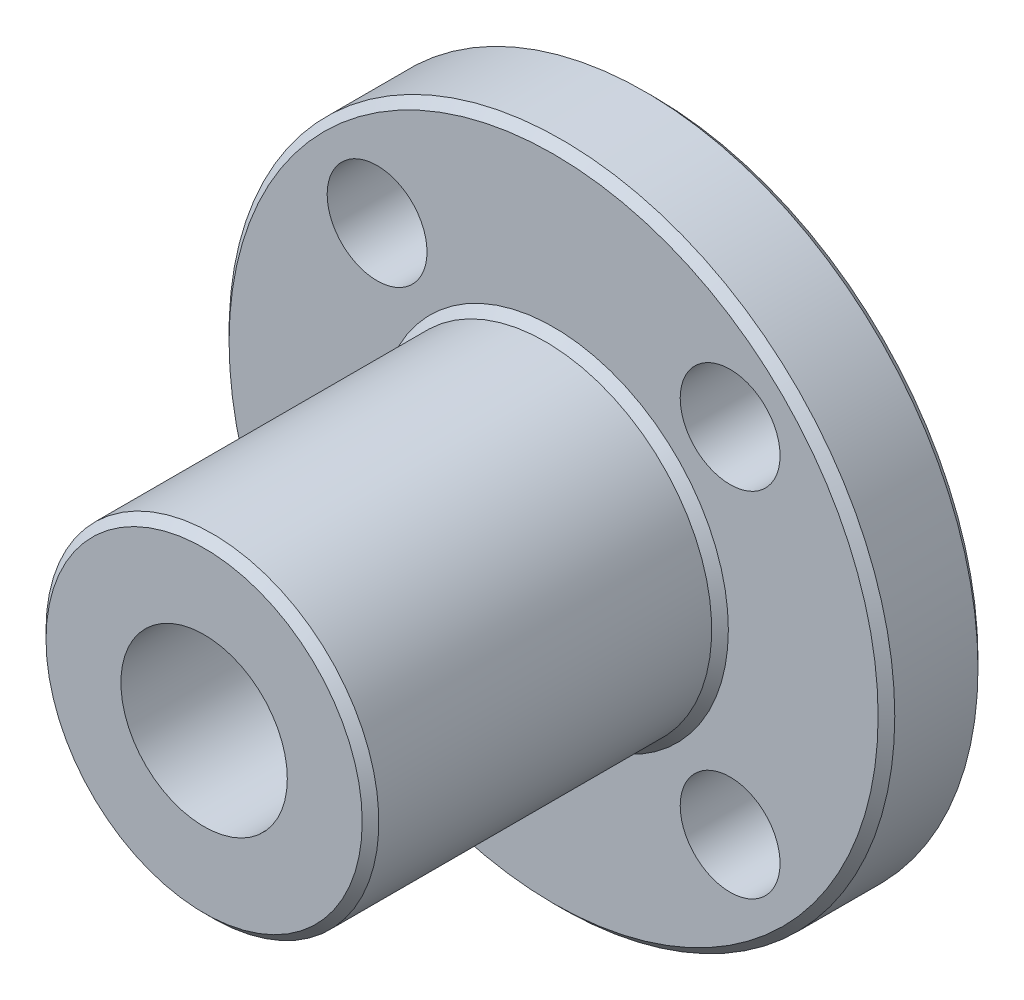
ISO-10303-21;
HEADER;
FILE_DESCRIPTION(('STEP AP214'),'2;1');
FILE_NAME('part.step','',(''),(''),'','','');
FILE_SCHEMA(('AUTOMOTIVE_DESIGN { 1 0 10303 214 1 1 1 1 }'));
ENDSEC;
DATA;
#1=APPLICATION_CONTEXT('core data for automotive mechanical design processes');
#2=APPLICATION_PROTOCOL_DEFINITION('international standard','automotive_design',2000,#1);
#3=PRODUCT_CONTEXT('',#1,'mechanical');
#4=PRODUCT('Part','Part','',(#3));
#5=PRODUCT_RELATED_PRODUCT_CATEGORY('part','',(#4));
#6=PRODUCT_DEFINITION_FORMATION('','',#4);
#7=PRODUCT_DEFINITION_CONTEXT('part definition',#1,'design');
#8=PRODUCT_DEFINITION('design','',#6,#7);
#9=PRODUCT_DEFINITION_SHAPE('','',#8);
#10=(LENGTH_UNIT() NAMED_UNIT(*) SI_UNIT(.MILLI.,.METRE.));
#11=(NAMED_UNIT(*) PLANE_ANGLE_UNIT() SI_UNIT($,.RADIAN.));
#12=(NAMED_UNIT(*) SI_UNIT($,.STERADIAN.) SOLID_ANGLE_UNIT());
#13=UNCERTAINTY_MEASURE_WITH_UNIT(LENGTH_MEASURE(1.E-05),#10,'distance_accuracy_value','');
#14=(GEOMETRIC_REPRESENTATION_CONTEXT(3) GLOBAL_UNCERTAINTY_ASSIGNED_CONTEXT((#13)) GLOBAL_UNIT_ASSIGNED_CONTEXT((#10,
#11,#12)) REPRESENTATION_CONTEXT('',''));
#15=CARTESIAN_POINT('',(0.,0.,0.));
#16=DIRECTION('',(0.,0.,1.));
#17=DIRECTION('',(1.,0.,0.));
#18=AXIS2_PLACEMENT_3D('',#15,#16,#17);
#19=CARTESIAN_POINT('',(0.,0.,3.));
#20=DIRECTION('',(0.,0.,-1.));
#21=DIRECTION('',(-1.,0.,0.));
#22=AXIS2_PLACEMENT_3D('',#19,#20,#21);
#23=CYLINDRICAL_SURFACE('',#22,10.);
#24=CARTESIAN_POINT('',(0.,0.,0.250000000000002));
#25=DIRECTION('',(0.,0.,1.));
#26=DIRECTION('',(1.,0.,0.));
#27=AXIS2_PLACEMENT_3D('',#24,#25,#26);
#28=CIRCLE('',#27,10.);
#29=CARTESIAN_POINT('',(10.,0.,0.250000000000002));
#30=VERTEX_POINT('',#29);
#31=EDGE_CURVE('E53',#30,#30,#28,.T.);
#32=ORIENTED_EDGE('',*,*,#31,.T.);
#33=EDGE_LOOP('',(#32));
#34=FACE_BOUND('',#33,.T.);
#35=CARTESIAN_POINT('',(0.,0.,2.75));
#36=DIRECTION('',(0.,0.,1.));
#37=DIRECTION('',(1.,0.,0.));
#38=AXIS2_PLACEMENT_3D('',#35,#36,#37);
#39=CIRCLE('',#38,10.);
#40=CARTESIAN_POINT('',(10.,0.,2.75));
#41=VERTEX_POINT('',#40);
#42=EDGE_CURVE('E58',#41,#41,#39,.F.);
#43=ORIENTED_EDGE('',*,*,#42,.T.);
#44=EDGE_LOOP('',(#43));
#45=FACE_BOUND('',#44,.T.);
#46=ADVANCED_FACE('F37',(#34,#45),#23,.T.);
#47=CARTESIAN_POINT('',(0.,0.,3.));
#48=DIRECTION('',(0.,0.,1.));
#49=DIRECTION('',(1.,0.,0.));
#50=AXIS2_PLACEMENT_3D('',#47,#48,#49);
#51=PLANE('',#50);
#52=CARTESIAN_POINT('',(5.30330085889883,-5.30330085889908,3.));
#53=DIRECTION('',(0.,0.,1.));
#54=DIRECTION('',(1.,0.,0.));
#55=AXIS2_PLACEMENT_3D('',#52,#53,#54);
#56=CIRCLE('',#55,1.50000000000016);
#57=CARTESIAN_POINT('',(6.80330085889899,-5.30330085889908,3.));
#58=VERTEX_POINT('',#57);
#59=EDGE_CURVE('E74',#58,#58,#56,.T.);
#60=ORIENTED_EDGE('',*,*,#59,.F.);
#61=EDGE_LOOP('',(#60));
#62=FACE_BOUND('',#61,.T.);
#63=CARTESIAN_POINT('',(-5.30330085889938,-5.30330085889883,3.));
#64=DIRECTION('',(0.,0.,1.));
#65=DIRECTION('',(1.,0.,0.));
#66=AXIS2_PLACEMENT_3D('',#63,#64,#65);
#67=CIRCLE('',#66,1.50000000000042);
#68=CARTESIAN_POINT('',(-3.80330085889896,-5.30330085889883,3.));
#69=VERTEX_POINT('',#68);
#70=EDGE_CURVE('E79',#69,#69,#67,.T.);
#71=ORIENTED_EDGE('',*,*,#70,.F.);
#72=EDGE_LOOP('',(#71));
#73=FACE_BOUND('',#72,.T.);
#74=CARTESIAN_POINT('',(-5.30330085889913,5.30330085889938,3.));
#75=DIRECTION('',(0.,0.,1.));
#76=DIRECTION('',(1.,0.,0.));
#77=AXIS2_PLACEMENT_3D('',#74,#75,#76);
#78=CIRCLE('',#77,1.50000000000031);
#79=CARTESIAN_POINT('',(-3.80330085889882,5.30330085889938,3.));
#80=VERTEX_POINT('',#79);
#81=EDGE_CURVE('E82',#80,#80,#78,.T.);
#82=ORIENTED_EDGE('',*,*,#81,.F.);
#83=EDGE_LOOP('',(#82));
#84=FACE_BOUND('',#83,.T.);
#85=CARTESIAN_POINT('',(5.30330085889908,5.30330085889913,3.));
#86=DIRECTION('',(0.,0.,1.));
#87=DIRECTION('',(1.,0.,0.));
#88=AXIS2_PLACEMENT_3D('',#85,#86,#87);
#89=CIRCLE('',#88,1.5);
#90=CARTESIAN_POINT('',(6.80330085889908,5.30330085889913,3.));
#91=VERTEX_POINT('',#90);
#92=EDGE_CURVE('E85',#91,#91,#89,.T.);
#93=ORIENTED_EDGE('',*,*,#92,.F.);
#94=EDGE_LOOP('',(#93));
#95=FACE_BOUND('',#94,.T.);
#96=CARTESIAN_POINT('',(0.,0.,3.));
#97=DIRECTION('',(0.,0.,1.));
#98=DIRECTION('',(1.,0.,0.));
#99=AXIS2_PLACEMENT_3D('',#96,#97,#98);
#100=CIRCLE('',#99,9.75);
#101=CARTESIAN_POINT('',(9.75,0.,3.));
#102=VERTEX_POINT('',#101);
#103=EDGE_CURVE('E10',#102,#102,#100,.T.);
#104=ORIENTED_EDGE('',*,*,#103,.T.);
#105=EDGE_LOOP('',(#104));
#106=FACE_BOUND('',#105,.T.);
#107=CARTESIAN_POINT('',(0.,0.,3.));
#108=DIRECTION('',(0.,0.,1.));
#109=DIRECTION('',(1.,0.,0.));
#110=AXIS2_PLACEMENT_3D('',#107,#108,#109);
#111=CIRCLE('',#110,5.25000000000002);
#112=CARTESIAN_POINT('',(5.25000000000002,0.,3.));
#113=VERTEX_POINT('',#112);
#114=EDGE_CURVE('E45',#113,#113,#111,.F.);
#115=ORIENTED_EDGE('',*,*,#114,.T.);
#116=EDGE_LOOP('',(#115));
#117=FACE_BOUND('',#116,.T.);
#118=ADVANCED_FACE('F107',(#62,#73,#84,#95,#106,#117),#51,.T.);
#119=CARTESIAN_POINT('',(0.,0.,0.));
#120=DIRECTION('',(0.,0.,1.));
#121=DIRECTION('',(1.,0.,0.));
#122=AXIS2_PLACEMENT_3D('',#119,#120,#121);
#123=PLANE('',#122);
#124=CARTESIAN_POINT('',(5.30330085889883,-5.30330085889908,0.));
#125=DIRECTION('',(0.,0.,-1.));
#126=DIRECTION('',(-1.,0.,0.));
#127=AXIS2_PLACEMENT_3D('',#124,#125,#126);
#128=CIRCLE('',#127,1.50000000000016);
#129=CARTESIAN_POINT('',(3.80330085889867,-5.30330085889908,0.));
#130=VERTEX_POINT('',#129);
#131=EDGE_CURVE('E92',#130,#130,#128,.T.);
#132=ORIENTED_EDGE('',*,*,#131,.F.);
#133=EDGE_LOOP('',(#132));
#134=FACE_BOUND('',#133,.T.);
#135=CARTESIAN_POINT('',(-5.30330085889938,-5.30330085889883,0.));
#136=DIRECTION('',(0.,0.,-1.));
#137=DIRECTION('',(-1.,0.,0.));
#138=AXIS2_PLACEMENT_3D('',#135,#136,#137);
#139=CIRCLE('',#138,1.50000000000042);
#140=CARTESIAN_POINT('',(-6.80330085889981,-5.30330085889883,0.));
#141=VERTEX_POINT('',#140);
#142=EDGE_CURVE('E95',#141,#141,#139,.T.);
#143=ORIENTED_EDGE('',*,*,#142,.F.);
#144=EDGE_LOOP('',(#143));
#145=FACE_BOUND('',#144,.T.);
#146=CARTESIAN_POINT('',(-5.30330085889913,5.30330085889938,0.));
#147=DIRECTION('',(0.,0.,-1.));
#148=DIRECTION('',(-1.,0.,0.));
#149=AXIS2_PLACEMENT_3D('',#146,#147,#148);
#150=CIRCLE('',#149,1.50000000000031);
#151=CARTESIAN_POINT('',(-6.80330085889945,5.30330085889938,0.));
#152=VERTEX_POINT('',#151);
#153=EDGE_CURVE('E91',#152,#152,#150,.T.);
#154=ORIENTED_EDGE('',*,*,#153,.F.);
#155=EDGE_LOOP('',(#154));
#156=FACE_BOUND('',#155,.T.);
#157=CARTESIAN_POINT('',(5.30330085889908,5.30330085889913,0.));
#158=DIRECTION('',(0.,0.,-1.));
#159=DIRECTION('',(-1.,0.,0.));
#160=AXIS2_PLACEMENT_3D('',#157,#158,#159);
#161=CIRCLE('',#160,1.5);
#162=CARTESIAN_POINT('',(3.80330085889908,5.30330085889913,0.));
#163=VERTEX_POINT('',#162);
#164=EDGE_CURVE('E88',#163,#163,#161,.T.);
#165=ORIENTED_EDGE('',*,*,#164,.F.);
#166=EDGE_LOOP('',(#165));
#167=FACE_BOUND('',#166,.T.);
#168=CARTESIAN_POINT('',(0.,0.,0.));
#169=DIRECTION('',(0.,0.,1.));
#170=DIRECTION('',(1.,0.,0.));
#171=AXIS2_PLACEMENT_3D('',#168,#169,#170);
#172=CIRCLE('',#171,9.75);
#173=CARTESIAN_POINT('',(9.75,0.,0.));
#174=VERTEX_POINT('',#173);
#175=EDGE_CURVE('E49',#174,#174,#172,.F.);
#176=ORIENTED_EDGE('',*,*,#175,.T.);
#177=EDGE_LOOP('',(#176));
#178=FACE_BOUND('',#177,.T.);
#179=CARTESIAN_POINT('',(0.,0.,0.));
#180=DIRECTION('',(0.,0.,1.));
#181=DIRECTION('',(1.,0.,0.));
#182=AXIS2_PLACEMENT_3D('',#179,#180,#181);
#183=CIRCLE('',#182,2.5);
#184=CARTESIAN_POINT('',(2.5,0.,0.));
#185=VERTEX_POINT('',#184);
#186=EDGE_CURVE('E70',#185,#185,#183,.T.);
#187=ORIENTED_EDGE('',*,*,#186,.T.);
#188=EDGE_LOOP('',(#187));
#189=FACE_BOUND('',#188,.T.);
#190=ADVANCED_FACE('F103',(#134,#145,#156,#167,#178,#189),#123,.F.);
#191=CARTESIAN_POINT('',(0.,0.,13.5));
#192=DIRECTION('',(0.,0.,-1.));
#193=DIRECTION('',(-1.,0.,0.));
#194=AXIS2_PLACEMENT_3D('',#191,#192,#193);
#195=CYLINDRICAL_SURFACE('',#194,5.);
#196=CARTESIAN_POINT('',(0.,0.,13.25));
#197=DIRECTION('',(0.,0.,1.));
#198=DIRECTION('',(1.,0.,0.));
#199=AXIS2_PLACEMENT_3D('',#196,#197,#198);
#200=CIRCLE('',#199,5.);
#201=CARTESIAN_POINT('',(-5.,0.,13.25));
#202=VERTEX_POINT('',#201);
#203=EDGE_CURVE('E61',#202,#202,#200,.F.);
#204=CARTESIAN_POINT('',(0.,0.,3.25000000000002));
#205=DIRECTION('',(0.,0.,1.));
#206=DIRECTION('',(1.,0.,0.));
#207=AXIS2_PLACEMENT_3D('',#204,#205,#206);
#208=CIRCLE('',#207,5.);
#209=CARTESIAN_POINT('',(-5.,0.,3.25000000000002));
#210=VERTEX_POINT('',#209);
#211=EDGE_CURVE('E64',#210,#210,#208,.T.);
#212=CARTESIAN_POINT('',(-5.,0.,13.25));
#213=CARTESIAN_POINT('',(-5.,0.,13.1458333333334));
#214=CARTESIAN_POINT('',(-5.,0.,13.0416666666667));
#215=CARTESIAN_POINT('',(-5.,0.,12.8333333333334));
#216=CARTESIAN_POINT('',(-5.,0.,12.7291666666667));
#217=CARTESIAN_POINT('',(-5.,0.,12.5208333333334));
#218=CARTESIAN_POINT('',(-5.,0.,12.4166666666667));
#219=CARTESIAN_POINT('',(-5.,0.,12.2083333333333));
#220=CARTESIAN_POINT('',(-5.,0.,12.1041666666667));
#221=CARTESIAN_POINT('',(-5.,0.,11.8958333333334));
#222=CARTESIAN_POINT('',(-5.,0.,11.7916666666667));
#223=CARTESIAN_POINT('',(-5.,0.,11.5833333333334));
#224=CARTESIAN_POINT('',(-5.,0.,11.4791666666667));
#225=CARTESIAN_POINT('',(-5.,0.,11.2708333333334));
#226=CARTESIAN_POINT('',(-5.,0.,11.1666666666667));
#227=CARTESIAN_POINT('',(-5.,0.,10.9583333333334));
#228=CARTESIAN_POINT('',(-5.,0.,10.8541666666667));
#229=CARTESIAN_POINT('',(-5.,0.,10.6458333333334));
#230=CARTESIAN_POINT('',(-5.,0.,10.5416666666667));
#231=CARTESIAN_POINT('',(-5.,0.,10.3333333333334));
#232=CARTESIAN_POINT('',(-5.,0.,10.2291666666667));
#233=CARTESIAN_POINT('',(-5.,0.,10.0208333333334));
#234=CARTESIAN_POINT('',(-5.,0.,9.91666666666669));
#235=CARTESIAN_POINT('',(-5.,0.,9.70833333333335));
#236=CARTESIAN_POINT('',(-5.,0.,9.60416666666669));
#237=CARTESIAN_POINT('',(-5.,0.,9.39583333333335));
#238=CARTESIAN_POINT('',(-5.,0.,9.29166666666669));
#239=CARTESIAN_POINT('',(-5.,0.,9.08333333333335));
#240=CARTESIAN_POINT('',(-5.,0.,8.97916666666669));
#241=CARTESIAN_POINT('',(-5.,0.,8.77083333333336));
#242=CARTESIAN_POINT('',(-5.,0.,8.66666666666669));
#243=CARTESIAN_POINT('',(-5.,0.,8.45833333333335));
#244=CARTESIAN_POINT('',(-5.,0.,8.35416666666669));
#245=CARTESIAN_POINT('',(-5.,0.,8.14583333333335));
#246=CARTESIAN_POINT('',(-5.,0.,8.04166666666669));
#247=CARTESIAN_POINT('',(-5.,0.,7.83333333333335));
#248=CARTESIAN_POINT('',(-5.,0.,7.72916666666669));
#249=CARTESIAN_POINT('',(-5.,0.,7.52083333333335));
#250=CARTESIAN_POINT('',(-5.,0.,7.41666666666669));
#251=CARTESIAN_POINT('',(-5.,0.,7.20833333333335));
#252=CARTESIAN_POINT('',(-5.,0.,7.10416666666669));
#253=CARTESIAN_POINT('',(-5.,0.,6.89583333333335));
#254=CARTESIAN_POINT('',(-5.,0.,6.79166666666669));
#255=CARTESIAN_POINT('',(-5.,0.,6.58333333333335));
#256=CARTESIAN_POINT('',(-5.,0.,6.47916666666669));
#257=CARTESIAN_POINT('',(-5.,0.,6.27083333333336));
#258=CARTESIAN_POINT('',(-5.,0.,6.16666666666669));
#259=CARTESIAN_POINT('',(-5.,0.,5.95833333333335));
#260=CARTESIAN_POINT('',(-5.,0.,5.85416666666669));
#261=CARTESIAN_POINT('',(-5.,0.,5.64583333333335));
#262=CARTESIAN_POINT('',(-5.,0.,5.54166666666669));
#263=CARTESIAN_POINT('',(-5.,0.,5.33333333333336));
#264=CARTESIAN_POINT('',(-5.,0.,5.22916666666669));
#265=CARTESIAN_POINT('',(-5.,0.,5.02083333333336));
#266=CARTESIAN_POINT('',(-5.,0.,4.91666666666669));
#267=CARTESIAN_POINT('',(-5.,0.,4.70833333333336));
#268=CARTESIAN_POINT('',(-5.,0.,4.60416666666669));
#269=CARTESIAN_POINT('',(-5.,0.,4.39583333333336));
#270=CARTESIAN_POINT('',(-5.,0.,4.29166666666669));
#271=CARTESIAN_POINT('',(-5.,0.,4.08333333333335));
#272=CARTESIAN_POINT('',(-5.,0.,3.97916666666669));
#273=CARTESIAN_POINT('',(-5.,0.,3.77083333333336));
#274=CARTESIAN_POINT('',(-5.,0.,3.66666666666669));
#275=CARTESIAN_POINT('',(-5.,0.,3.45833333333336));
#276=CARTESIAN_POINT('',(-5.,0.,3.35416666666669));
#277=CARTESIAN_POINT('',(-5.,0.,3.25000000000002));
#278=B_SPLINE_CURVE_WITH_KNOTS('',3,(#212,#213,#214,#215,#216,#217,#218,#219,#220,#221,#222,
#223,#224,#225,#226,#227,#228,#229,#230,#231,#232,#233,#234,#235,#236,#237,#238,#239,#240,#241,
#242,#243,#244,#245,#246,#247,#248,#249,#250,#251,#252,#253,#254,#255,#256,#257,#258,#259,#260,
#261,#262,#263,#264,#265,#266,#267,#268,#269,#270,#271,#272,#273,#274,#275,#276,#277),
.UNSPECIFIED.,.F.,.F.,(4,2,2,2,2,2,2,2,2,2,2,2,2,2,2,2,2,2,2,2,2,2,2,2,2,2,2,2,2,2,2,2,4),(0.,
0.312499999999999,0.624999999999999,0.937499999999999,1.25,1.5625,1.875,2.1875,2.5,2.8125,3.125,
3.4375,3.75,4.0625,4.375,4.6875,5.,5.3125,5.625,5.9375,6.25,6.5625,6.875,7.1875,7.5,
7.81249999999999,8.12499999999999,8.43749999999999,8.75,9.0625,9.37499999999999,
9.68749999999999,9.99999999999999),.UNSPECIFIED.);
#279=EDGE_CURVE('BSEAM106',#202,#210,#278,.T.);
#280=ORIENTED_EDGE('',*,*,#203,.T.);
#281=ORIENTED_EDGE('',*,*,#211,.T.);
#282=ORIENTED_EDGE('',*,*,#279,.T.);
#283=ORIENTED_EDGE('',*,*,#279,.F.);
#284=EDGE_LOOP('',(#280,#282,#281,#283));
#285=FACE_BOUND('',#284,.T.);
#286=ADVANCED_FACE('F106',(#285),#195,.T.);
#287=CARTESIAN_POINT('',(0.,0.,13.5));
#288=DIRECTION('',(0.,0.,1.));
#289=DIRECTION('',(1.,0.,0.));
#290=AXIS2_PLACEMENT_3D('',#287,#288,#289);
#291=PLANE('',#290);
#292=CARTESIAN_POINT('',(0.,0.,13.5));
#293=DIRECTION('',(0.,0.,1.));
#294=DIRECTION('',(1.,0.,0.));
#295=AXIS2_PLACEMENT_3D('',#292,#293,#294);
#296=CIRCLE('',#295,4.75000000000002);
#297=CARTESIAN_POINT('',(4.75000000000002,0.,13.5));
#298=VERTEX_POINT('',#297);
#299=EDGE_CURVE('E67',#298,#298,#296,.T.);
#300=ORIENTED_EDGE('',*,*,#299,.T.);
#301=EDGE_LOOP('',(#300));
#302=FACE_BOUND('',#301,.T.);
#303=CARTESIAN_POINT('',(0.,0.,13.5));
#304=DIRECTION('',(0.,0.,1.));
#305=DIRECTION('',(1.,0.,0.));
#306=AXIS2_PLACEMENT_3D('',#303,#304,#305);
#307=CIRCLE('',#306,2.5);
#308=CARTESIAN_POINT('',(2.5,0.,13.5));
#309=VERTEX_POINT('',#308);
#310=EDGE_CURVE('E71',#309,#309,#307,.T.);
#311=ORIENTED_EDGE('',*,*,#310,.F.);
#312=EDGE_LOOP('',(#311));
#313=FACE_BOUND('',#312,.T.);
#314=ADVANCED_FACE('F120',(#302,#313),#291,.T.);
#315=CARTESIAN_POINT('',(0.,0.,0.));
#316=DIRECTION('',(0.,0.,1.));
#317=DIRECTION('',(1.,0.,0.));
#318=AXIS2_PLACEMENT_3D('',#315,#316,#317);
#319=CYLINDRICAL_SURFACE('',#318,2.5);
#320=ORIENTED_EDGE('',*,*,#186,.F.);
#321=EDGE_LOOP('',(#320));
#322=FACE_BOUND('',#321,.T.);
#323=ORIENTED_EDGE('',*,*,#310,.T.);
#324=EDGE_LOOP('',(#323));
#325=FACE_BOUND('',#324,.T.);
#326=ADVANCED_FACE('F116',(#322,#325),#319,.F.);
#327=CARTESIAN_POINT('',(0.,0.,13.5));
#328=DIRECTION('',(0.,0.,-1.));
#329=DIRECTION('',(-1.,0.,0.));
#330=AXIS2_PLACEMENT_3D('',#327,#328,#329);
#331=CONICAL_SURFACE('',#330,4.75000000000002,0.785398163397448);
#332=ORIENTED_EDGE('',*,*,#203,.F.);
#333=EDGE_LOOP('',(#332));
#334=FACE_BOUND('',#333,.T.);
#335=ORIENTED_EDGE('',*,*,#299,.F.);
#336=EDGE_LOOP('',(#335));
#337=FACE_BOUND('',#336,.T.);
#338=ADVANCED_FACE('F119',(#334,#337),#331,.T.);
#339=CARTESIAN_POINT('',(0.,0.,0.250000000000002));
#340=DIRECTION('',(0.,0.,1.));
#341=DIRECTION('',(1.,0.,0.));
#342=AXIS2_PLACEMENT_3D('',#339,#340,#341);
#343=CONICAL_SURFACE('',#342,10.,0.785398163397452);
#344=ORIENTED_EDGE('',*,*,#175,.F.);
#345=EDGE_LOOP('',(#344));
#346=FACE_BOUND('',#345,.T.);
#347=ORIENTED_EDGE('',*,*,#31,.F.);
#348=EDGE_LOOP('',(#347));
#349=FACE_BOUND('',#348,.T.);
#350=ADVANCED_FACE('F148',(#346,#349),#343,.T.);
#351=CARTESIAN_POINT('',(0.,0.,3.));
#352=DIRECTION('',(0.,0.,-1.));
#353=DIRECTION('',(-1.,0.,0.));
#354=AXIS2_PLACEMENT_3D('',#351,#352,#353);
#355=CONICAL_SURFACE('',#354,9.75,0.785398163397441);
#356=ORIENTED_EDGE('',*,*,#42,.F.);
#357=EDGE_LOOP('',(#356));
#358=FACE_BOUND('',#357,.T.);
#359=ORIENTED_EDGE('',*,*,#103,.F.);
#360=EDGE_LOOP('',(#359));
#361=FACE_BOUND('',#360,.T.);
#362=ADVANCED_FACE('F154',(#358,#361),#355,.T.);
#363=CARTESIAN_POINT('',(0.,0.,3.25000000000002));
#364=DIRECTION('',(0.,0.,-1.));
#365=DIRECTION('',(-1.,0.,0.));
#366=AXIS2_PLACEMENT_3D('',#363,#364,#365);
#367=CONICAL_SURFACE('',#366,5.,0.785398163397448);
#368=ORIENTED_EDGE('',*,*,#114,.F.);
#369=EDGE_LOOP('',(#368));
#370=FACE_BOUND('',#369,.T.);
#371=ORIENTED_EDGE('',*,*,#211,.F.);
#372=EDGE_LOOP('',(#371));
#373=FACE_BOUND('',#372,.T.);
#374=ADVANCED_FACE('F40',(#370,#373),#367,.T.);
#375=CARTESIAN_POINT('',(5.30330085889908,5.30330085889913,13.5));
#376=DIRECTION('',(0.,0.,-1.));
#377=DIRECTION('',(-1.,0.,0.));
#378=AXIS2_PLACEMENT_3D('',#375,#376,#377);
#379=CYLINDRICAL_SURFACE('',#378,1.5);
#380=ORIENTED_EDGE('',*,*,#92,.T.);
#381=EDGE_LOOP('',(#380));
#382=FACE_BOUND('',#381,.T.);
#383=ORIENTED_EDGE('',*,*,#164,.T.);
#384=EDGE_LOOP('',(#383));
#385=FACE_BOUND('',#384,.T.);
#386=ADVANCED_FACE('F163',(#382,#385),#379,.F.);
#387=CARTESIAN_POINT('',(-5.30330085889913,5.30330085889938,13.5));
#388=DIRECTION('',(0.,0.,-1.));
#389=DIRECTION('',(-1.,0.,0.));
#390=AXIS2_PLACEMENT_3D('',#387,#388,#389);
#391=CYLINDRICAL_SURFACE('',#390,1.50000000000031);
#392=ORIENTED_EDGE('',*,*,#81,.T.);
#393=EDGE_LOOP('',(#392));
#394=FACE_BOUND('',#393,.T.);
#395=ORIENTED_EDGE('',*,*,#153,.T.);
#396=EDGE_LOOP('',(#395));
#397=FACE_BOUND('',#396,.T.);
#398=ADVANCED_FACE('F101',(#394,#397),#391,.F.);
#399=CARTESIAN_POINT('',(-5.30330085889938,-5.30330085889883,13.5));
#400=DIRECTION('',(0.,0.,-1.));
#401=DIRECTION('',(-1.,0.,0.));
#402=AXIS2_PLACEMENT_3D('',#399,#400,#401);
#403=CYLINDRICAL_SURFACE('',#402,1.50000000000042);
#404=ORIENTED_EDGE('',*,*,#70,.T.);
#405=EDGE_LOOP('',(#404));
#406=FACE_BOUND('',#405,.T.);
#407=ORIENTED_EDGE('',*,*,#142,.T.);
#408=EDGE_LOOP('',(#407));
#409=FACE_BOUND('',#408,.T.);
#410=ADVANCED_FACE('F178',(#406,#409),#403,.F.);
#411=CARTESIAN_POINT('',(5.30330085889883,-5.30330085889908,13.5));
#412=DIRECTION('',(0.,0.,-1.));
#413=DIRECTION('',(-1.,0.,0.));
#414=AXIS2_PLACEMENT_3D('',#411,#412,#413);
#415=CYLINDRICAL_SURFACE('',#414,1.50000000000016);
#416=ORIENTED_EDGE('',*,*,#59,.T.);
#417=EDGE_LOOP('',(#416));
#418=FACE_BOUND('',#417,.T.);
#419=ORIENTED_EDGE('',*,*,#131,.T.);
#420=EDGE_LOOP('',(#419));
#421=FACE_BOUND('',#420,.T.);
#422=ADVANCED_FACE('F183',(#418,#421),#415,.F.);
#423=CLOSED_SHELL('',(#46,#118,#190,#286,#314,#326,#338,#350,#362,#374,#386,#398,#410,#422));
#424=MANIFOLD_SOLID_BREP('B2',#423);
#425=ADVANCED_BREP_SHAPE_REPRESENTATION('',(#18,#424),#14);
#426=SHAPE_DEFINITION_REPRESENTATION(#9,#425);
ENDSEC;
END-ISO-10303-21;
